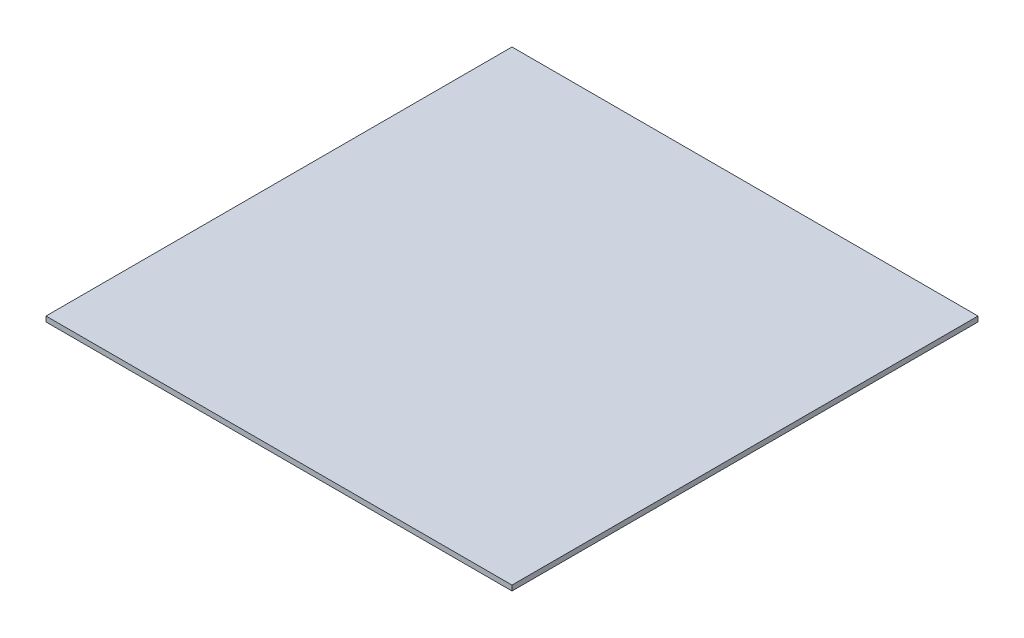
ISO-10303-21;
HEADER;
FILE_DESCRIPTION(('STEP AP214'),'2;1');
FILE_NAME('part.step','',(''),(''),'','','');
FILE_SCHEMA(('AUTOMOTIVE_DESIGN { 1 0 10303 214 1 1 1 1 }'));
ENDSEC;
DATA;
#1=APPLICATION_CONTEXT('core data for automotive mechanical design processes');
#2=APPLICATION_PROTOCOL_DEFINITION('international standard','automotive_design',2000,#1);
#3=PRODUCT_CONTEXT('',#1,'mechanical');
#4=PRODUCT('Part','Part','',(#3));
#5=PRODUCT_RELATED_PRODUCT_CATEGORY('part','',(#4));
#6=PRODUCT_DEFINITION_FORMATION('','',#4);
#7=PRODUCT_DEFINITION_CONTEXT('part definition',#1,'design');
#8=PRODUCT_DEFINITION('design','',#6,#7);
#9=PRODUCT_DEFINITION_SHAPE('','',#8);
#10=(LENGTH_UNIT() NAMED_UNIT(*) SI_UNIT(.MILLI.,.METRE.));
#11=(NAMED_UNIT(*) PLANE_ANGLE_UNIT() SI_UNIT($,.RADIAN.));
#12=(NAMED_UNIT(*) SI_UNIT($,.STERADIAN.) SOLID_ANGLE_UNIT());
#13=UNCERTAINTY_MEASURE_WITH_UNIT(LENGTH_MEASURE(1.E-05),#10,'distance_accuracy_value','');
#14=(GEOMETRIC_REPRESENTATION_CONTEXT(3) GLOBAL_UNCERTAINTY_ASSIGNED_CONTEXT((#13)) GLOBAL_UNIT_ASSIGNED_CONTEXT((#10,
#11,#12)) REPRESENTATION_CONTEXT('',''));
#15=CARTESIAN_POINT('',(0.,0.,0.));
#16=DIRECTION('',(0.,0.,1.));
#17=DIRECTION('',(1.,0.,0.));
#18=AXIS2_PLACEMENT_3D('',#15,#16,#17);
#19=CARTESIAN_POINT('',(-450.,10.,450.));
#20=DIRECTION('',(1.,0.,0.));
#21=DIRECTION('',(0.,0.,-1.));
#22=AXIS2_PLACEMENT_3D('',#19,#20,#21);
#23=PLANE('',#22);
#24=DIRECTION('',(0.,0.,1.));
#25=VECTOR('',#24,1.);
#26=CARTESIAN_POINT('',(-450.,0.,450.));
#27=LINE('',#26,#25);
#28=CARTESIAN_POINT('',(-450.,0.,-450.));
#29=VERTEX_POINT('',#28);
#30=CARTESIAN_POINT('',(-450.,0.,450.));
#31=VERTEX_POINT('',#30);
#32=EDGE_CURVE('E99',#29,#31,#27,.T.);
#33=ORIENTED_EDGE('',*,*,#32,.T.);
#34=DIRECTION('',(0.,-1.,0.));
#35=VECTOR('',#34,1.);
#36=CARTESIAN_POINT('',(-450.,10.,450.));
#37=LINE('',#36,#35);
#38=CARTESIAN_POINT('',(-450.,10.,450.));
#39=VERTEX_POINT('',#38);
#40=EDGE_CURVE('E11',#39,#31,#37,.T.);
#41=ORIENTED_EDGE('',*,*,#40,.F.);
#42=DIRECTION('',(0.,0.,1.));
#43=VECTOR('',#42,1.);
#44=CARTESIAN_POINT('',(-450.,10.,450.));
#45=LINE('',#44,#43);
#46=CARTESIAN_POINT('',(-450.,10.,-450.));
#47=VERTEX_POINT('',#46);
#48=EDGE_CURVE('E87',#47,#39,#45,.T.);
#49=ORIENTED_EDGE('',*,*,#48,.F.);
#50=DIRECTION('',(0.,-1.,0.));
#51=VECTOR('',#50,1.);
#52=CARTESIAN_POINT('',(-450.,10.,-450.));
#53=LINE('',#52,#51);
#54=EDGE_CURVE('E95',#47,#29,#53,.T.);
#55=ORIENTED_EDGE('',*,*,#54,.T.);
#56=EDGE_LOOP('',(#33,#41,#49,#55));
#57=FACE_BOUND('',#56,.T.);
#58=ADVANCED_FACE('F36',(#57),#23,.F.);
#59=CARTESIAN_POINT('',(450.,10.,450.));
#60=DIRECTION('',(0.,0.,-1.));
#61=DIRECTION('',(-1.,0.,0.));
#62=AXIS2_PLACEMENT_3D('',#59,#60,#61);
#63=PLANE('',#62);
#64=DIRECTION('',(1.,0.,0.));
#65=VECTOR('',#64,1.);
#66=CARTESIAN_POINT('',(450.,0.,450.));
#67=LINE('',#66,#65);
#68=CARTESIAN_POINT('',(450.,0.,450.));
#69=VERTEX_POINT('',#68);
#70=EDGE_CURVE('E91',#31,#69,#67,.T.);
#71=ORIENTED_EDGE('',*,*,#70,.T.);
#72=DIRECTION('',(0.,-1.,0.));
#73=VECTOR('',#72,1.);
#74=CARTESIAN_POINT('',(450.,10.,450.));
#75=LINE('',#74,#73);
#76=CARTESIAN_POINT('',(450.,10.,450.));
#77=VERTEX_POINT('',#76);
#78=EDGE_CURVE('E44',#77,#69,#75,.T.);
#79=ORIENTED_EDGE('',*,*,#78,.F.);
#80=DIRECTION('',(1.,0.,0.));
#81=VECTOR('',#80,1.);
#82=CARTESIAN_POINT('',(450.,10.,450.));
#83=LINE('',#82,#81);
#84=EDGE_CURVE('E82',#39,#77,#83,.T.);
#85=ORIENTED_EDGE('',*,*,#84,.F.);
#86=ORIENTED_EDGE('',*,*,#40,.T.);
#87=EDGE_LOOP('',(#71,#79,#85,#86));
#88=FACE_BOUND('',#87,.T.);
#89=ADVANCED_FACE('F90',(#88),#63,.F.);
#90=CARTESIAN_POINT('',(450.,10.,450.));
#91=DIRECTION('',(-1.,0.,0.));
#92=DIRECTION('',(0.,0.,1.));
#93=AXIS2_PLACEMENT_3D('',#90,#91,#92);
#94=PLANE('',#93);
#95=DIRECTION('',(0.,0.,-1.));
#96=VECTOR('',#95,1.);
#97=CARTESIAN_POINT('',(450.,0.,450.));
#98=LINE('',#97,#96);
#99=CARTESIAN_POINT('',(450.,0.,-450.));
#100=VERTEX_POINT('',#99);
#101=EDGE_CURVE('E69',#69,#100,#98,.T.);
#102=ORIENTED_EDGE('',*,*,#101,.T.);
#103=DIRECTION('',(0.,-1.,0.));
#104=VECTOR('',#103,1.);
#105=CARTESIAN_POINT('',(450.,10.,-450.));
#106=LINE('',#105,#104);
#107=CARTESIAN_POINT('',(450.,10.,-450.));
#108=VERTEX_POINT('',#107);
#109=EDGE_CURVE('E92',#108,#100,#106,.T.);
#110=ORIENTED_EDGE('',*,*,#109,.F.);
#111=DIRECTION('',(0.,0.,-1.));
#112=VECTOR('',#111,1.);
#113=CARTESIAN_POINT('',(450.,10.,450.));
#114=LINE('',#113,#112);
#115=EDGE_CURVE('E85',#77,#108,#114,.T.);
#116=ORIENTED_EDGE('',*,*,#115,.F.);
#117=ORIENTED_EDGE('',*,*,#78,.T.);
#118=EDGE_LOOP('',(#102,#110,#116,#117));
#119=FACE_BOUND('',#118,.T.);
#120=ADVANCED_FACE('F93',(#119),#94,.F.);
#121=CARTESIAN_POINT('',(450.,10.,-450.));
#122=DIRECTION('',(0.,0.,1.));
#123=DIRECTION('',(1.,0.,0.));
#124=AXIS2_PLACEMENT_3D('',#121,#122,#123);
#125=PLANE('',#124);
#126=DIRECTION('',(-1.,0.,0.));
#127=VECTOR('',#126,1.);
#128=CARTESIAN_POINT('',(450.,0.,-450.));
#129=LINE('',#128,#127);
#130=EDGE_CURVE('E75',#100,#29,#129,.T.);
#131=ORIENTED_EDGE('',*,*,#130,.T.);
#132=ORIENTED_EDGE('',*,*,#54,.F.);
#133=DIRECTION('',(-1.,0.,0.));
#134=VECTOR('',#133,1.);
#135=CARTESIAN_POINT('',(450.,10.,-450.));
#136=LINE('',#135,#134);
#137=EDGE_CURVE('E52',#108,#47,#136,.T.);
#138=ORIENTED_EDGE('',*,*,#137,.F.);
#139=ORIENTED_EDGE('',*,*,#109,.T.);
#140=EDGE_LOOP('',(#131,#132,#138,#139));
#141=FACE_BOUND('',#140,.T.);
#142=ADVANCED_FACE('F106',(#141),#125,.F.);
#143=CARTESIAN_POINT('',(0.,10.,0.));
#144=DIRECTION('',(0.,1.,0.));
#145=DIRECTION('',(0.,0.,1.));
#146=AXIS2_PLACEMENT_3D('',#143,#144,#145);
#147=PLANE('',#146);
#148=ORIENTED_EDGE('',*,*,#48,.T.);
#149=ORIENTED_EDGE('',*,*,#84,.T.);
#150=ORIENTED_EDGE('',*,*,#115,.T.);
#151=ORIENTED_EDGE('',*,*,#137,.T.);
#152=EDGE_LOOP('',(#148,#149,#150,#151));
#153=FACE_BOUND('',#152,.T.);
#154=ADVANCED_FACE('F83',(#153),#147,.T.);
#155=CARTESIAN_POINT('',(0.,0.,0.));
#156=DIRECTION('',(0.,1.,0.));
#157=DIRECTION('',(0.,0.,1.));
#158=AXIS2_PLACEMENT_3D('',#155,#156,#157);
#159=PLANE('',#158);
#160=ORIENTED_EDGE('',*,*,#32,.F.);
#161=ORIENTED_EDGE('',*,*,#130,.F.);
#162=ORIENTED_EDGE('',*,*,#101,.F.);
#163=ORIENTED_EDGE('',*,*,#70,.F.);
#164=EDGE_LOOP('',(#160,#161,#162,#163));
#165=FACE_BOUND('',#164,.T.);
#166=ADVANCED_FACE('F109',(#165),#159,.F.);
#167=CLOSED_SHELL('',(#58,#89,#120,#142,#154,#166));
#168=MANIFOLD_SOLID_BREP('B2',#167);
#169=ADVANCED_BREP_SHAPE_REPRESENTATION('',(#18,#168),#14);
#170=SHAPE_DEFINITION_REPRESENTATION(#9,#169);
ENDSEC;
END-ISO-10303-21;
